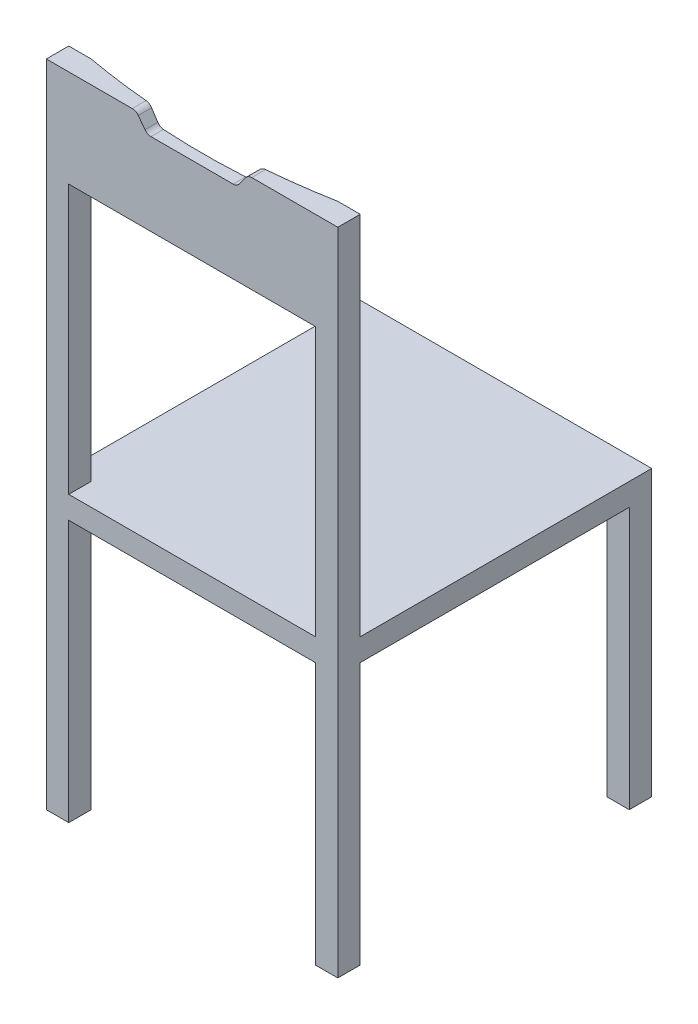
ISO-10303-21;
HEADER;
FILE_DESCRIPTION(('STEP AP214'),'2;1');
FILE_NAME('part.step','',(''),(''),'','','');
FILE_SCHEMA(('AUTOMOTIVE_DESIGN { 1 0 10303 214 1 1 1 1 }'));
ENDSEC;
DATA;
#1=APPLICATION_CONTEXT('core data for automotive mechanical design processes');
#2=APPLICATION_PROTOCOL_DEFINITION('international standard','automotive_design',2000,#1);
#3=PRODUCT_CONTEXT('',#1,'mechanical');
#4=PRODUCT('Part','Part','',(#3));
#5=PRODUCT_RELATED_PRODUCT_CATEGORY('part','',(#4));
#6=PRODUCT_DEFINITION_FORMATION('','',#4);
#7=PRODUCT_DEFINITION_CONTEXT('part definition',#1,'design');
#8=PRODUCT_DEFINITION('design','',#6,#7);
#9=PRODUCT_DEFINITION_SHAPE('','',#8);
#10=(LENGTH_UNIT() NAMED_UNIT(*) SI_UNIT(.MILLI.,.METRE.));
#11=(NAMED_UNIT(*) PLANE_ANGLE_UNIT() SI_UNIT($,.RADIAN.));
#12=(NAMED_UNIT(*) SI_UNIT($,.STERADIAN.) SOLID_ANGLE_UNIT());
#13=UNCERTAINTY_MEASURE_WITH_UNIT(LENGTH_MEASURE(1.E-05),#10,'distance_accuracy_value','');
#14=(GEOMETRIC_REPRESENTATION_CONTEXT(3) GLOBAL_UNCERTAINTY_ASSIGNED_CONTEXT((#13)) GLOBAL_UNIT_ASSIGNED_CONTEXT((#10,
#11,#12)) REPRESENTATION_CONTEXT('',''));
#15=CARTESIAN_POINT('',(0.,0.,0.));
#16=DIRECTION('',(0.,0.,1.));
#17=DIRECTION('',(1.,0.,0.));
#18=AXIS2_PLACEMENT_3D('',#15,#16,#17);
#19=CARTESIAN_POINT('',(0.,489.54,0.));
#20=DIRECTION('',(0.,-1.,0.));
#21=DIRECTION('',(0.,0.,-1.));
#22=AXIS2_PLACEMENT_3D('',#19,#20,#21);
#23=PLANE('',#22);
#24=DIRECTION('',(1.,0.,0.));
#25=VECTOR('',#24,1.);
#26=CARTESIAN_POINT('',(-195.,489.54,210.));
#27=LINE('',#26,#25);
#28=CARTESIAN_POINT('',(-195.,489.54,210.));
#29=VERTEX_POINT('',#28);
#30=CARTESIAN_POINT('',(-80.0000000000001,489.54,210.));
#31=VERTEX_POINT('',#30);
#32=EDGE_CURVE('E365',#29,#31,#27,.T.);
#33=ORIENTED_EDGE('',*,*,#32,.T.);
#34=DIRECTION('',(0.,0.,1.));
#35=VECTOR('',#34,1.);
#36=CARTESIAN_POINT('',(-80.0000000000001,489.54,0.));
#37=LINE('',#36,#35);
#38=CARTESIAN_POINT('',(-80.0000000000001,489.54,191.496023030271));
#39=VERTEX_POINT('',#38);
#40=EDGE_CURVE('E50',#31,#39,#37,.F.);
#41=ORIENTED_EDGE('',*,*,#40,.T.);
#42=CARTESIAN_POINT('',(0.,489.54,-719.999999999999));
#43=DIRECTION('',(0.,-1.,0.));
#44=DIRECTION('',(0.,0.,1.));
#45=AXIS2_PLACEMENT_3D('',#42,#43,#44);
#46=CIRCLE('',#45,914.999999999999);
#47=CARTESIAN_POINT('',(-165.,489.54,180.));
#48=VERTEX_POINT('',#47);
#49=EDGE_CURVE('E513',#39,#48,#46,.T.);
#50=ORIENTED_EDGE('',*,*,#49,.T.);
#51=DIRECTION('',(-1.,0.,0.));
#52=VECTOR('',#51,1.);
#53=CARTESIAN_POINT('',(-195.,489.54,180.));
#54=LINE('',#53,#52);
#55=CARTESIAN_POINT('',(-195.,489.54,180.));
#56=VERTEX_POINT('',#55);
#57=EDGE_CURVE('E340',#48,#56,#54,.T.);
#58=ORIENTED_EDGE('',*,*,#57,.T.);
#59=DIRECTION('',(0.,0.,1.));
#60=VECTOR('',#59,1.);
#61=CARTESIAN_POINT('',(-195.,489.54,210.));
#62=LINE('',#61,#60);
#63=EDGE_CURVE('E361',#56,#29,#62,.T.);
#64=ORIENTED_EDGE('',*,*,#63,.T.);
#65=EDGE_LOOP('',(#33,#41,#50,#58,#64));
#66=FACE_BOUND('',#65,.T.);
#67=ADVANCED_FACE('F41',(#66),#23,.F.);
#68=CARTESIAN_POINT('',(-165.,-430.,210.));
#69=DIRECTION('',(1.,0.,0.));
#70=DIRECTION('',(0.,0.,-1.));
#71=AXIS2_PLACEMENT_3D('',#68,#69,#70);
#72=PLANE('',#71);
#73=DIRECTION('',(0.,1.,0.));
#74=VECTOR('',#73,1.);
#75=CARTESIAN_POINT('',(-165.,-430.,180.));
#76=LINE('',#75,#74);
#77=CARTESIAN_POINT('',(-165.,0.,180.));
#78=VERTEX_POINT('',#77);
#79=CARTESIAN_POINT('',(-165.,359.54,180.));
#80=VERTEX_POINT('',#79);
#81=EDGE_CURVE('E368',#78,#80,#76,.T.);
#82=ORIENTED_EDGE('',*,*,#81,.T.);
#83=DIRECTION('',(0.,0.,1.));
#84=VECTOR('',#83,1.);
#85=CARTESIAN_POINT('',(-165.,359.54,180.));
#86=LINE('',#85,#84);
#87=CARTESIAN_POINT('',(-165.,359.54,210.));
#88=VERTEX_POINT('',#87);
#89=EDGE_CURVE('E605',#80,#88,#86,.T.);
#90=ORIENTED_EDGE('',*,*,#89,.T.);
#91=DIRECTION('',(0.,1.,0.));
#92=VECTOR('',#91,1.);
#93=CARTESIAN_POINT('',(-165.,-430.,210.));
#94=LINE('',#93,#92);
#95=CARTESIAN_POINT('',(-165.,0.,210.));
#96=VERTEX_POINT('',#95);
#97=EDGE_CURVE('E372',#96,#88,#94,.T.);
#98=ORIENTED_EDGE('',*,*,#97,.F.);
#99=DIRECTION('',(0.,0.,1.));
#100=VECTOR('',#99,1.);
#101=CARTESIAN_POINT('',(-165.,0.,180.));
#102=LINE('',#101,#100);
#103=EDGE_CURVE('E344',#78,#96,#102,.T.);
#104=ORIENTED_EDGE('',*,*,#103,.F.);
#105=EDGE_LOOP('',(#82,#90,#98,#104));
#106=FACE_BOUND('',#105,.T.);
#107=ADVANCED_FACE('F468',(#106),#72,.T.);
#108=CARTESIAN_POINT('',(165.,-430.,210.));
#109=DIRECTION('',(-1.,0.,0.));
#110=DIRECTION('',(0.,0.,1.));
#111=AXIS2_PLACEMENT_3D('',#108,#109,#110);
#112=PLANE('',#111);
#113=DIRECTION('',(0.,1.,0.));
#114=VECTOR('',#113,1.);
#115=CARTESIAN_POINT('',(165.,-430.,210.));
#116=LINE('',#115,#114);
#117=CARTESIAN_POINT('',(165.,0.,210.));
#118=VERTEX_POINT('',#117);
#119=CARTESIAN_POINT('',(165.,359.54,210.));
#120=VERTEX_POINT('',#119);
#121=EDGE_CURVE('E293',#118,#120,#116,.T.);
#122=ORIENTED_EDGE('',*,*,#121,.T.);
#123=DIRECTION('',(0.,0.,-1.));
#124=VECTOR('',#123,1.);
#125=CARTESIAN_POINT('',(165.,359.54,210.));
#126=LINE('',#125,#124);
#127=CARTESIAN_POINT('',(165.,359.54,180.));
#128=VERTEX_POINT('',#127);
#129=EDGE_CURVE('E602',#120,#128,#126,.T.);
#130=ORIENTED_EDGE('',*,*,#129,.T.);
#131=DIRECTION('',(0.,1.,0.));
#132=VECTOR('',#131,1.);
#133=CARTESIAN_POINT('',(165.,-430.,180.));
#134=LINE('',#133,#132);
#135=CARTESIAN_POINT('',(165.,0.,180.));
#136=VERTEX_POINT('',#135);
#137=EDGE_CURVE('E297',#136,#128,#134,.T.);
#138=ORIENTED_EDGE('',*,*,#137,.F.);
#139=DIRECTION('',(0.,0.,-1.));
#140=VECTOR('',#139,1.);
#141=CARTESIAN_POINT('',(165.,0.,210.));
#142=LINE('',#141,#140);
#143=EDGE_CURVE('E350',#118,#136,#142,.T.);
#144=ORIENTED_EDGE('',*,*,#143,.F.);
#145=EDGE_LOOP('',(#122,#130,#138,#144));
#146=FACE_BOUND('',#145,.T.);
#147=ADVANCED_FACE('F435',(#146),#112,.T.);
#148=CARTESIAN_POINT('',(-195.,-430.,180.));
#149=DIRECTION('',(0.,0.,-1.));
#150=DIRECTION('',(-1.,0.,0.));
#151=AXIS2_PLACEMENT_3D('',#148,#149,#150);
#152=PLANE('',#151);
#153=ORIENTED_EDGE('',*,*,#81,.F.);
#154=DIRECTION('',(1.,0.,0.));
#155=VECTOR('',#154,1.);
#156=CARTESIAN_POINT('',(-195.,0.,180.));
#157=LINE('',#156,#155);
#158=CARTESIAN_POINT('',(-195.,0.,180.));
#159=VERTEX_POINT('',#158);
#160=EDGE_CURVE('E342',#159,#78,#157,.T.);
#161=ORIENTED_EDGE('',*,*,#160,.F.);
#162=DIRECTION('',(0.,1.,0.));
#163=VECTOR('',#162,1.);
#164=CARTESIAN_POINT('',(-195.,-430.,180.));
#165=LINE('',#164,#163);
#166=EDGE_CURVE('E377',#159,#56,#165,.T.);
#167=ORIENTED_EDGE('',*,*,#166,.T.);
#168=ORIENTED_EDGE('',*,*,#57,.F.);
#169=DIRECTION('',(0.,1.,0.));
#170=VECTOR('',#169,1.);
#171=CARTESIAN_POINT('',(-165.,359.54,180.));
#172=LINE('',#171,#170);
#173=EDGE_CURVE('E612',#80,#48,#172,.T.);
#174=ORIENTED_EDGE('',*,*,#173,.F.);
#175=EDGE_LOOP('',(#153,#161,#167,#168,#174));
#176=FACE_BOUND('',#175,.T.);
#177=ADVANCED_FACE('F465',(#176),#152,.T.);
#178=DIRECTION('',(0.,0.,1.));
#179=VECTOR('',#178,1.);
#180=CARTESIAN_POINT('',(-165.,-380.46,210.));
#181=LINE('',#180,#179);
#182=CARTESIAN_POINT('',(-165.,-380.46,180.));
#183=VERTEX_POINT('',#182);
#184=CARTESIAN_POINT('',(-165.,-380.46,210.));
#185=VERTEX_POINT('',#184);
#186=EDGE_CURVE('E635',#183,#185,#181,.T.);
#187=ORIENTED_EDGE('',*,*,#186,.F.);
#188=CARTESIAN_POINT('',(-165.,-30.,180.));
#189=VERTEX_POINT('',#188);
#190=EDGE_CURVE('E378',#183,#189,#76,.T.);
#191=ORIENTED_EDGE('',*,*,#190,.T.);
#192=DIRECTION('',(0.,0.,1.));
#193=VECTOR('',#192,1.);
#194=CARTESIAN_POINT('',(-165.,-30.,180.));
#195=LINE('',#194,#193);
#196=CARTESIAN_POINT('',(-165.,-30.,210.));
#197=VERTEX_POINT('',#196);
#198=EDGE_CURVE('E317',#189,#197,#195,.T.);
#199=ORIENTED_EDGE('',*,*,#198,.T.);
#200=EDGE_CURVE('E369',#185,#197,#94,.T.);
#201=ORIENTED_EDGE('',*,*,#200,.F.);
#202=EDGE_LOOP('',(#187,#191,#199,#201));
#203=FACE_BOUND('',#202,.T.);
#204=ADVANCED_FACE('F457',(#203),#72,.T.);
#205=CARTESIAN_POINT('',(-195.,-430.,210.));
#206=DIRECTION('',(0.,0.,1.));
#207=DIRECTION('',(1.,0.,0.));
#208=AXIS2_PLACEMENT_3D('',#205,#206,#207);
#209=PLANE('',#208);
#210=DIRECTION('',(-1.,0.,0.));
#211=VECTOR('',#210,1.);
#212=CARTESIAN_POINT('',(-195.,-380.46,210.));
#213=LINE('',#212,#211);
#214=CARTESIAN_POINT('',(195.,-380.46,210.));
#215=VERTEX_POINT('',#214);
#216=CARTESIAN_POINT('',(165.,-380.46,210.));
#217=VERTEX_POINT('',#216);
#218=EDGE_CURVE('E632',#215,#217,#213,.T.);
#219=ORIENTED_EDGE('',*,*,#218,.F.);
#220=DIRECTION('',(0.,1.,0.));
#221=VECTOR('',#220,1.);
#222=CARTESIAN_POINT('',(195.,-430.,210.));
#223=LINE('',#222,#221);
#224=CARTESIAN_POINT('',(195.,489.54,210.));
#225=VERTEX_POINT('',#224);
#226=EDGE_CURVE('E301',#215,#225,#223,.T.);
#227=ORIENTED_EDGE('',*,*,#226,.T.);
#228=CARTESIAN_POINT('',(80.0000000000001,489.54,210.));
#229=VERTEX_POINT('',#228);
#230=EDGE_CURVE('E364',#229,#225,#27,.T.);
#231=ORIENTED_EDGE('',*,*,#230,.F.);
#232=CARTESIAN_POINT('',(80.0000000000001,479.54,210.));
#233=DIRECTION('',(0.,0.,1.));
#234=DIRECTION('',(1.,0.,0.));
#235=AXIS2_PLACEMENT_3D('',#232,#233,#234);
#236=CIRCLE('',#235,10.);
#237=CARTESIAN_POINT('',(72.,485.54,210.));
#238=VERTEX_POINT('',#237);
#239=EDGE_CURVE('E384',#229,#238,#236,.T.);
#240=ORIENTED_EDGE('',*,*,#239,.T.);
#241=DIRECTION('',(0.599999999999999,0.800000000000001,0.));
#242=VECTOR('',#241,1.);
#243=CARTESIAN_POINT('',(75.,489.54,210.));
#244=LINE('',#243,#242);
#245=CARTESIAN_POINT('',(63.,473.54,210.));
#246=VERTEX_POINT('',#245);
#247=EDGE_CURVE('E520',#246,#238,#244,.T.);
#248=ORIENTED_EDGE('',*,*,#247,.F.);
#249=CARTESIAN_POINT('',(55.,479.54,210.));
#250=DIRECTION('',(0.,0.,1.));
#251=DIRECTION('',(-1.,0.,0.));
#252=AXIS2_PLACEMENT_3D('',#249,#250,#251);
#253=CIRCLE('',#252,10.);
#254=CARTESIAN_POINT('',(55.,469.54,210.));
#255=VERTEX_POINT('',#254);
#256=EDGE_CURVE('E527',#255,#246,#253,.T.);
#257=ORIENTED_EDGE('',*,*,#256,.F.);
#258=DIRECTION('',(1.,0.,0.));
#259=VECTOR('',#258,1.);
#260=CARTESIAN_POINT('',(-55.,469.54,210.));
#261=LINE('',#260,#259);
#262=CARTESIAN_POINT('',(-55.,469.54,210.));
#263=VERTEX_POINT('',#262);
#264=EDGE_CURVE('E532',#263,#255,#261,.T.);
#265=ORIENTED_EDGE('',*,*,#264,.F.);
#266=CARTESIAN_POINT('',(-55.,479.54,210.));
#267=DIRECTION('',(0.,0.,1.));
#268=DIRECTION('',(1.,0.,0.));
#269=AXIS2_PLACEMENT_3D('',#266,#267,#268);
#270=CIRCLE('',#269,10.);
#271=CARTESIAN_POINT('',(-63.,473.54,210.));
#272=VERTEX_POINT('',#271);
#273=EDGE_CURVE('E583',#272,#263,#270,.T.);
#274=ORIENTED_EDGE('',*,*,#273,.F.);
#275=DIRECTION('',(0.599999999999999,-0.800000000000001,0.));
#276=VECTOR('',#275,1.);
#277=CARTESIAN_POINT('',(-75.,489.54,210.));
#278=LINE('',#277,#276);
#279=CARTESIAN_POINT('',(-72.,485.54,210.));
#280=VERTEX_POINT('',#279);
#281=EDGE_CURVE('E585',#280,#272,#278,.T.);
#282=ORIENTED_EDGE('',*,*,#281,.F.);
#283=CARTESIAN_POINT('',(-80.0000000000001,479.54,210.));
#284=DIRECTION('',(0.,0.,1.));
#285=DIRECTION('',(1.,0.,0.));
#286=AXIS2_PLACEMENT_3D('',#283,#284,#285);
#287=CIRCLE('',#286,10.);
#288=EDGE_CURVE('E382',#280,#31,#287,.T.);
#289=ORIENTED_EDGE('',*,*,#288,.T.);
#290=ORIENTED_EDGE('',*,*,#32,.F.);
#291=DIRECTION('',(0.,1.,0.));
#292=VECTOR('',#291,1.);
#293=CARTESIAN_POINT('',(-195.,-430.,210.));
#294=LINE('',#293,#292);
#295=CARTESIAN_POINT('',(-195.,-380.46,210.));
#296=VERTEX_POINT('',#295);
#297=EDGE_CURVE('E373',#296,#29,#294,.T.);
#298=ORIENTED_EDGE('',*,*,#297,.F.);
#299=EDGE_CURVE('E629',#185,#296,#213,.T.);
#300=ORIENTED_EDGE('',*,*,#299,.F.);
#301=ORIENTED_EDGE('',*,*,#200,.T.);
#302=DIRECTION('',(1.,0.,0.));
#303=VECTOR('',#302,1.);
#304=CARTESIAN_POINT('',(-165.,-30.,210.));
#305=LINE('',#304,#303);
#306=CARTESIAN_POINT('',(165.,-30.,210.));
#307=VERTEX_POINT('',#306);
#308=EDGE_CURVE('E320',#197,#307,#305,.T.);
#309=ORIENTED_EDGE('',*,*,#308,.T.);
#310=EDGE_CURVE('E303',#217,#307,#116,.T.);
#311=ORIENTED_EDGE('',*,*,#310,.F.);
#312=EDGE_LOOP('',(#219,#227,#231,#240,#248,#257,#265,#274,#282,#289,#290,#298,#300,#301,#309,#311));
#313=FACE_BOUND('',#312,.T.);
#314=ORIENTED_EDGE('',*,*,#97,.T.);
#315=DIRECTION('',(1.,0.,0.));
#316=VECTOR('',#315,1.);
#317=CARTESIAN_POINT('',(-165.,359.54,210.));
#318=LINE('',#317,#316);
#319=EDGE_CURVE('E613',#88,#120,#318,.T.);
#320=ORIENTED_EDGE('',*,*,#319,.T.);
#321=ORIENTED_EDGE('',*,*,#121,.F.);
#322=DIRECTION('',(1.,0.,0.));
#323=VECTOR('',#322,1.);
#324=CARTESIAN_POINT('',(-165.,0.,210.));
#325=LINE('',#324,#323);
#326=EDGE_CURVE('E347',#96,#118,#325,.T.);
#327=ORIENTED_EDGE('',*,*,#326,.F.);
#328=EDGE_LOOP('',(#314,#320,#321,#327));
#329=FACE_BOUND('',#328,.T.);
#330=ADVANCED_FACE('F453',(#313,#329),#209,.T.);
#331=CARTESIAN_POINT('',(-195.,-430.,210.));
#332=DIRECTION('',(-1.,0.,0.));
#333=DIRECTION('',(0.,0.,1.));
#334=AXIS2_PLACEMENT_3D('',#331,#332,#333);
#335=PLANE('',#334);
#336=DIRECTION('',(0.,0.,1.));
#337=VECTOR('',#336,1.);
#338=CARTESIAN_POINT('',(-195.,-380.46,-210.));
#339=LINE('',#338,#337);
#340=CARTESIAN_POINT('',(-195.,-380.46,180.));
#341=VERTEX_POINT('',#340);
#342=EDGE_CURVE('E57',#341,#296,#339,.T.);
#343=ORIENTED_EDGE('',*,*,#342,.T.);
#344=ORIENTED_EDGE('',*,*,#297,.T.);
#345=ORIENTED_EDGE('',*,*,#63,.F.);
#346=ORIENTED_EDGE('',*,*,#166,.F.);
#347=DIRECTION('',(0.,0.,1.));
#348=VECTOR('',#347,1.);
#349=CARTESIAN_POINT('',(-195.,0.,180.));
#350=LINE('',#349,#348);
#351=CARTESIAN_POINT('',(-195.,0.,-210.));
#352=VERTEX_POINT('',#351);
#353=EDGE_CURVE('E296',#352,#159,#350,.T.);
#354=ORIENTED_EDGE('',*,*,#353,.F.);
#355=DIRECTION('',(0.,1.,0.));
#356=VECTOR('',#355,1.);
#357=CARTESIAN_POINT('',(-195.,-430.,-210.));
#358=LINE('',#357,#356);
#359=CARTESIAN_POINT('',(-195.,-380.46,-210.));
#360=VERTEX_POINT('',#359);
#361=EDGE_CURVE('E280',#360,#352,#358,.T.);
#362=ORIENTED_EDGE('',*,*,#361,.F.);
#363=CARTESIAN_POINT('',(-195.,-380.46,-180.));
#364=VERTEX_POINT('',#363);
#365=EDGE_CURVE('E658',#360,#364,#339,.T.);
#366=ORIENTED_EDGE('',*,*,#365,.T.);
#367=DIRECTION('',(0.,1.,0.));
#368=VECTOR('',#367,1.);
#369=CARTESIAN_POINT('',(-195.,-430.,-180.));
#370=LINE('',#369,#368);
#371=CARTESIAN_POINT('',(-195.,-30.,-180.));
#372=VERTEX_POINT('',#371);
#373=EDGE_CURVE('E272',#364,#372,#370,.T.);
#374=ORIENTED_EDGE('',*,*,#373,.T.);
#375=DIRECTION('',(0.,0.,1.));
#376=VECTOR('',#375,1.);
#377=CARTESIAN_POINT('',(-195.,-30.,180.));
#378=LINE('',#377,#376);
#379=CARTESIAN_POINT('',(-195.,-30.,180.));
#380=VERTEX_POINT('',#379);
#381=EDGE_CURVE('E311',#372,#380,#378,.T.);
#382=ORIENTED_EDGE('',*,*,#381,.T.);
#383=EDGE_CURVE('E375',#341,#380,#165,.T.);
#384=ORIENTED_EDGE('',*,*,#383,.F.);
#385=EDGE_LOOP('',(#343,#344,#345,#346,#354,#362,#366,#374,#382,#384));
#386=FACE_BOUND('',#385,.T.);
#387=ADVANCED_FACE('F456',(#386),#335,.T.);
#388=DIRECTION('',(1.,0.,0.));
#389=VECTOR('',#388,1.);
#390=CARTESIAN_POINT('',(-195.,-380.46,180.));
#391=LINE('',#390,#389);
#392=EDGE_CURVE('E642',#341,#183,#391,.T.);
#393=ORIENTED_EDGE('',*,*,#392,.F.);
#394=ORIENTED_EDGE('',*,*,#383,.T.);
#395=DIRECTION('',(1.,0.,0.));
#396=VECTOR('',#395,1.);
#397=CARTESIAN_POINT('',(-195.,-30.,180.));
#398=LINE('',#397,#396);
#399=EDGE_CURVE('E314',#380,#189,#398,.T.);
#400=ORIENTED_EDGE('',*,*,#399,.T.);
#401=ORIENTED_EDGE('',*,*,#190,.F.);
#402=EDGE_LOOP('',(#393,#394,#400,#401));
#403=FACE_BOUND('',#402,.T.);
#404=ADVANCED_FACE('F451',(#403),#152,.T.);
#405=CARTESIAN_POINT('',(165.,489.54,180.));
#406=VERTEX_POINT('',#405);
#407=CARTESIAN_POINT('',(80.0000000000001,489.54,191.496023030271));
#408=VERTEX_POINT('',#407);
#409=EDGE_CURVE('E503',#406,#408,#46,.T.);
#410=ORIENTED_EDGE('',*,*,#409,.T.);
#411=DIRECTION('',(0.,0.,1.));
#412=VECTOR('',#411,1.);
#413=CARTESIAN_POINT('',(80.0000000000001,489.54,0.));
#414=LINE('',#413,#412);
#415=EDGE_CURVE('E371',#408,#229,#414,.T.);
#416=ORIENTED_EDGE('',*,*,#415,.T.);
#417=ORIENTED_EDGE('',*,*,#230,.T.);
#418=DIRECTION('',(0.,0.,-1.));
#419=VECTOR('',#418,1.);
#420=CARTESIAN_POINT('',(195.,489.54,210.));
#421=LINE('',#420,#419);
#422=CARTESIAN_POINT('',(195.,489.54,180.));
#423=VERTEX_POINT('',#422);
#424=EDGE_CURVE('E282',#225,#423,#421,.T.);
#425=ORIENTED_EDGE('',*,*,#424,.T.);
#426=DIRECTION('',(-1.,0.,0.));
#427=VECTOR('',#426,1.);
#428=CARTESIAN_POINT('',(195.,489.54,180.));
#429=LINE('',#428,#427);
#430=EDGE_CURVE('E290',#423,#406,#429,.T.);
#431=ORIENTED_EDGE('',*,*,#430,.T.);
#432=EDGE_LOOP('',(#410,#416,#417,#425,#431));
#433=FACE_BOUND('',#432,.T.);
#434=ADVANCED_FACE('F446',(#433),#23,.F.);
#435=CARTESIAN_POINT('',(-165.,-30.,-210.));
#436=DIRECTION('',(0.,0.,-1.));
#437=DIRECTION('',(-1.,0.,0.));
#438=AXIS2_PLACEMENT_3D('',#435,#436,#437);
#439=PLANE('',#438);
#440=DIRECTION('',(-1.,0.,0.));
#441=VECTOR('',#440,1.);
#442=CARTESIAN_POINT('',(-195.,-380.46,-210.));
#443=LINE('',#442,#441);
#444=CARTESIAN_POINT('',(-165.,-380.46,-210.));
#445=VERTEX_POINT('',#444);
#446=EDGE_CURVE('E254',#445,#360,#443,.T.);
#447=ORIENTED_EDGE('',*,*,#446,.T.);
#448=ORIENTED_EDGE('',*,*,#361,.T.);
#449=DIRECTION('',(-1.,0.,0.));
#450=VECTOR('',#449,1.);
#451=CARTESIAN_POINT('',(-165.,0.,-210.));
#452=LINE('',#451,#450);
#453=CARTESIAN_POINT('',(195.,0.,-210.));
#454=VERTEX_POINT('',#453);
#455=EDGE_CURVE('E268',#454,#352,#452,.T.);
#456=ORIENTED_EDGE('',*,*,#455,.F.);
#457=DIRECTION('',(0.,1.,0.));
#458=VECTOR('',#457,1.);
#459=CARTESIAN_POINT('',(195.,-430.,-210.));
#460=LINE('',#459,#458);
#461=CARTESIAN_POINT('',(195.,-380.46,-210.));
#462=VERTEX_POINT('',#461);
#463=EDGE_CURVE('E260',#462,#454,#460,.T.);
#464=ORIENTED_EDGE('',*,*,#463,.F.);
#465=CARTESIAN_POINT('',(165.,-380.46,-210.));
#466=VERTEX_POINT('',#465);
#467=EDGE_CURVE('E243',#462,#466,#443,.T.);
#468=ORIENTED_EDGE('',*,*,#467,.T.);
#469=DIRECTION('',(0.,1.,0.));
#470=VECTOR('',#469,1.);
#471=CARTESIAN_POINT('',(165.,-430.,-210.));
#472=LINE('',#471,#470);
#473=CARTESIAN_POINT('',(165.,-30.,-210.));
#474=VERTEX_POINT('',#473);
#475=EDGE_CURVE('E270',#466,#474,#472,.T.);
#476=ORIENTED_EDGE('',*,*,#475,.T.);
#477=DIRECTION('',(-1.,0.,0.));
#478=VECTOR('',#477,1.);
#479=CARTESIAN_POINT('',(-165.,-30.,-210.));
#480=LINE('',#479,#478);
#481=CARTESIAN_POINT('',(-165.,-30.,-210.));
#482=VERTEX_POINT('',#481);
#483=EDGE_CURVE('E337',#474,#482,#480,.T.);
#484=ORIENTED_EDGE('',*,*,#483,.T.);
#485=DIRECTION('',(0.,1.,0.));
#486=VECTOR('',#485,1.);
#487=CARTESIAN_POINT('',(-165.,-430.,-210.));
#488=LINE('',#487,#486);
#489=EDGE_CURVE('E283',#445,#482,#488,.T.);
#490=ORIENTED_EDGE('',*,*,#489,.F.);
#491=EDGE_LOOP('',(#447,#448,#456,#464,#468,#476,#484,#490));
#492=FACE_BOUND('',#491,.T.);
#493=ADVANCED_FACE('F266',(#492),#439,.T.);
#494=CARTESIAN_POINT('',(195.,-30.,-180.));
#495=DIRECTION('',(1.,0.,0.));
#496=DIRECTION('',(0.,0.,-1.));
#497=AXIS2_PLACEMENT_3D('',#494,#495,#496);
#498=PLANE('',#497);
#499=DIRECTION('',(0.,0.,1.));
#500=VECTOR('',#499,1.);
#501=CARTESIAN_POINT('',(195.,-380.46,-210.));
#502=LINE('',#501,#500);
#503=CARTESIAN_POINT('',(195.,-380.46,-180.));
#504=VERTEX_POINT('',#503);
#505=EDGE_CURVE('E246',#462,#504,#502,.T.);
#506=ORIENTED_EDGE('',*,*,#505,.F.);
#507=ORIENTED_EDGE('',*,*,#463,.T.);
#508=DIRECTION('',(0.,0.,-1.));
#509=VECTOR('',#508,1.);
#510=CARTESIAN_POINT('',(195.,0.,-180.));
#511=LINE('',#510,#509);
#512=CARTESIAN_POINT('',(195.,0.,180.));
#513=VERTEX_POINT('',#512);
#514=EDGE_CURVE('E356',#513,#454,#511,.T.);
#515=ORIENTED_EDGE('',*,*,#514,.F.);
#516=DIRECTION('',(0.,1.,0.));
#517=VECTOR('',#516,1.);
#518=CARTESIAN_POINT('',(195.,-430.,180.));
#519=LINE('',#518,#517);
#520=EDGE_CURVE('E300',#513,#423,#519,.T.);
#521=ORIENTED_EDGE('',*,*,#520,.T.);
#522=ORIENTED_EDGE('',*,*,#424,.F.);
#523=ORIENTED_EDGE('',*,*,#226,.F.);
#524=CARTESIAN_POINT('',(195.,-380.46,180.));
#525=VERTEX_POINT('',#524);
#526=EDGE_CURVE('E253',#525,#215,#502,.T.);
#527=ORIENTED_EDGE('',*,*,#526,.F.);
#528=CARTESIAN_POINT('',(195.,-30.,180.));
#529=VERTEX_POINT('',#528);
#530=EDGE_CURVE('E298',#525,#529,#519,.T.);
#531=ORIENTED_EDGE('',*,*,#530,.T.);
#532=DIRECTION('',(0.,0.,-1.));
#533=VECTOR('',#532,1.);
#534=CARTESIAN_POINT('',(195.,-30.,-180.));
#535=LINE('',#534,#533);
#536=CARTESIAN_POINT('',(195.,-30.,-180.));
#537=VERTEX_POINT('',#536);
#538=EDGE_CURVE('E329',#529,#537,#535,.T.);
#539=ORIENTED_EDGE('',*,*,#538,.T.);
#540=DIRECTION('',(0.,1.,0.));
#541=VECTOR('',#540,1.);
#542=CARTESIAN_POINT('',(195.,-430.,-180.));
#543=LINE('',#542,#541);
#544=EDGE_CURVE('E263',#504,#537,#543,.T.);
#545=ORIENTED_EDGE('',*,*,#544,.F.);
#546=EDGE_LOOP('',(#506,#507,#515,#521,#522,#523,#527,#531,#539,#545));
#547=FACE_BOUND('',#546,.T.);
#548=ADVANCED_FACE('F258',(#547),#498,.T.);
#549=CARTESIAN_POINT('',(0.,-30.,0.));
#550=DIRECTION('',(0.,-1.,0.));
#551=DIRECTION('',(0.,0.,-1.));
#552=AXIS2_PLACEMENT_3D('',#549,#550,#551);
#553=PLANE('',#552);
#554=DIRECTION('',(0.,0.,1.));
#555=VECTOR('',#554,1.);
#556=CARTESIAN_POINT('',(-165.,-30.,-180.));
#557=LINE('',#556,#555);
#558=CARTESIAN_POINT('',(-165.,-30.,-180.));
#559=VERTEX_POINT('',#558);
#560=EDGE_CURVE('E305',#482,#559,#557,.T.);
#561=ORIENTED_EDGE('',*,*,#560,.F.);
#562=ORIENTED_EDGE('',*,*,#483,.F.);
#563=DIRECTION('',(0.,0.,-1.));
#564=VECTOR('',#563,1.);
#565=CARTESIAN_POINT('',(165.,-30.,-210.));
#566=LINE('',#565,#564);
#567=CARTESIAN_POINT('',(165.,-30.,-180.));
#568=VERTEX_POINT('',#567);
#569=EDGE_CURVE('E334',#568,#474,#566,.T.);
#570=ORIENTED_EDGE('',*,*,#569,.F.);
#571=DIRECTION('',(-1.,0.,0.));
#572=VECTOR('',#571,1.);
#573=CARTESIAN_POINT('',(165.,-30.,-180.));
#574=LINE('',#573,#572);
#575=EDGE_CURVE('E331',#537,#568,#574,.T.);
#576=ORIENTED_EDGE('',*,*,#575,.F.);
#577=ORIENTED_EDGE('',*,*,#538,.F.);
#578=DIRECTION('',(1.,0.,0.));
#579=VECTOR('',#578,1.);
#580=CARTESIAN_POINT('',(165.,-30.,180.));
#581=LINE('',#580,#579);
#582=CARTESIAN_POINT('',(165.,-30.,180.));
#583=VERTEX_POINT('',#582);
#584=EDGE_CURVE('E326',#583,#529,#581,.T.);
#585=ORIENTED_EDGE('',*,*,#584,.F.);
#586=DIRECTION('',(0.,0.,-1.));
#587=VECTOR('',#586,1.);
#588=CARTESIAN_POINT('',(165.,-30.,210.));
#589=LINE('',#588,#587);
#590=EDGE_CURVE('E323',#307,#583,#589,.T.);
#591=ORIENTED_EDGE('',*,*,#590,.F.);
#592=ORIENTED_EDGE('',*,*,#308,.F.);
#593=ORIENTED_EDGE('',*,*,#198,.F.);
#594=ORIENTED_EDGE('',*,*,#399,.F.);
#595=ORIENTED_EDGE('',*,*,#381,.F.);
#596=DIRECTION('',(-1.,0.,0.));
#597=VECTOR('',#596,1.);
#598=CARTESIAN_POINT('',(-195.,-30.,-180.));
#599=LINE('',#598,#597);
#600=EDGE_CURVE('E308',#559,#372,#599,.T.);
#601=ORIENTED_EDGE('',*,*,#600,.F.);
#602=EDGE_LOOP('',(#561,#562,#570,#576,#577,#585,#591,#592,#593,#594,#595,#601));
#603=FACE_BOUND('',#602,.T.);
#604=ADVANCED_FACE('F436',(#603),#553,.T.);
#605=CARTESIAN_POINT('',(0.,0.,0.));
#606=DIRECTION('',(0.,-1.,0.));
#607=DIRECTION('',(0.,0.,-1.));
#608=AXIS2_PLACEMENT_3D('',#605,#606,#607);
#609=PLANE('',#608);
#610=ORIENTED_EDGE('',*,*,#514,.T.);
#611=ORIENTED_EDGE('',*,*,#455,.T.);
#612=ORIENTED_EDGE('',*,*,#353,.T.);
#613=ORIENTED_EDGE('',*,*,#160,.T.);
#614=ORIENTED_EDGE('',*,*,#103,.T.);
#615=ORIENTED_EDGE('',*,*,#326,.T.);
#616=ORIENTED_EDGE('',*,*,#143,.T.);
#617=DIRECTION('',(1.,0.,0.));
#618=VECTOR('',#617,1.);
#619=CARTESIAN_POINT('',(165.,0.,180.));
#620=LINE('',#619,#618);
#621=EDGE_CURVE('E353',#136,#513,#620,.T.);
#622=ORIENTED_EDGE('',*,*,#621,.T.);
#623=EDGE_LOOP('',(#610,#611,#612,#613,#614,#615,#616,#622));
#624=FACE_BOUND('',#623,.T.);
#625=ADVANCED_FACE('F439',(#624),#609,.F.);
#626=CARTESIAN_POINT('',(195.,-430.,180.));
#627=DIRECTION('',(0.,0.,-1.));
#628=DIRECTION('',(-1.,0.,0.));
#629=AXIS2_PLACEMENT_3D('',#626,#627,#628);
#630=PLANE('',#629);
#631=ORIENTED_EDGE('',*,*,#621,.F.);
#632=ORIENTED_EDGE('',*,*,#137,.T.);
#633=DIRECTION('',(0.,1.,0.));
#634=VECTOR('',#633,1.);
#635=CARTESIAN_POINT('',(165.,359.54,180.));
#636=LINE('',#635,#634);
#637=EDGE_CURVE('E279',#128,#406,#636,.T.);
#638=ORIENTED_EDGE('',*,*,#637,.T.);
#639=ORIENTED_EDGE('',*,*,#430,.F.);
#640=ORIENTED_EDGE('',*,*,#520,.F.);
#641=EDGE_LOOP('',(#631,#632,#638,#639,#640));
#642=FACE_BOUND('',#641,.T.);
#643=ADVANCED_FACE('F431',(#642),#630,.T.);
#644=DIRECTION('',(0.,0.,-1.));
#645=VECTOR('',#644,1.);
#646=CARTESIAN_POINT('',(165.,-380.46,210.));
#647=LINE('',#646,#645);
#648=CARTESIAN_POINT('',(165.,-380.46,180.));
#649=VERTEX_POINT('',#648);
#650=EDGE_CURVE('E65',#217,#649,#647,.T.);
#651=ORIENTED_EDGE('',*,*,#650,.F.);
#652=ORIENTED_EDGE('',*,*,#310,.T.);
#653=ORIENTED_EDGE('',*,*,#590,.T.);
#654=EDGE_CURVE('E294',#649,#583,#134,.T.);
#655=ORIENTED_EDGE('',*,*,#654,.F.);
#656=EDGE_LOOP('',(#651,#652,#653,#655));
#657=FACE_BOUND('',#656,.T.);
#658=ADVANCED_FACE('F429',(#657),#112,.T.);
#659=DIRECTION('',(1.,0.,0.));
#660=VECTOR('',#659,1.);
#661=CARTESIAN_POINT('',(195.,-380.46,180.));
#662=LINE('',#661,#660);
#663=EDGE_CURVE('E664',#649,#525,#662,.T.);
#664=ORIENTED_EDGE('',*,*,#663,.F.);
#665=ORIENTED_EDGE('',*,*,#654,.T.);
#666=ORIENTED_EDGE('',*,*,#584,.T.);
#667=ORIENTED_EDGE('',*,*,#530,.F.);
#668=EDGE_LOOP('',(#664,#665,#666,#667));
#669=FACE_BOUND('',#668,.T.);
#670=ADVANCED_FACE('F422',(#669),#630,.T.);
#671=CARTESIAN_POINT('',(-165.,-430.,-180.));
#672=DIRECTION('',(1.,0.,0.));
#673=DIRECTION('',(0.,0.,-1.));
#674=AXIS2_PLACEMENT_3D('',#671,#672,#673);
#675=PLANE('',#674);
#676=DIRECTION('',(0.,0.,1.));
#677=VECTOR('',#676,1.);
#678=CARTESIAN_POINT('',(-165.,-380.46,-180.));
#679=LINE('',#678,#677);
#680=CARTESIAN_POINT('',(-165.,-380.46,-180.));
#681=VERTEX_POINT('',#680);
#682=EDGE_CURVE('E652',#445,#681,#679,.T.);
#683=ORIENTED_EDGE('',*,*,#682,.F.);
#684=ORIENTED_EDGE('',*,*,#489,.T.);
#685=ORIENTED_EDGE('',*,*,#560,.T.);
#686=DIRECTION('',(0.,1.,0.));
#687=VECTOR('',#686,1.);
#688=CARTESIAN_POINT('',(-165.,-430.,-180.));
#689=LINE('',#688,#687);
#690=EDGE_CURVE('E285',#681,#559,#689,.T.);
#691=ORIENTED_EDGE('',*,*,#690,.F.);
#692=EDGE_LOOP('',(#683,#684,#685,#691));
#693=FACE_BOUND('',#692,.T.);
#694=ADVANCED_FACE('F419',(#693),#675,.T.);
#695=CARTESIAN_POINT('',(-165.,-430.,-180.));
#696=DIRECTION('',(0.,0.,1.));
#697=DIRECTION('',(1.,0.,0.));
#698=AXIS2_PLACEMENT_3D('',#695,#696,#697);
#699=PLANE('',#698);
#700=DIRECTION('',(-1.,0.,0.));
#701=VECTOR('',#700,1.);
#702=CARTESIAN_POINT('',(-165.,-380.46,-180.));
#703=LINE('',#702,#701);
#704=EDGE_CURVE('E649',#681,#364,#703,.T.);
#705=ORIENTED_EDGE('',*,*,#704,.F.);
#706=ORIENTED_EDGE('',*,*,#690,.T.);
#707=ORIENTED_EDGE('',*,*,#600,.T.);
#708=ORIENTED_EDGE('',*,*,#373,.F.);
#709=EDGE_LOOP('',(#705,#706,#707,#708));
#710=FACE_BOUND('',#709,.T.);
#711=ADVANCED_FACE('F417',(#710),#699,.T.);
#712=CARTESIAN_POINT('',(165.,-430.,-180.));
#713=DIRECTION('',(-1.,0.,0.));
#714=DIRECTION('',(0.,0.,1.));
#715=AXIS2_PLACEMENT_3D('',#712,#713,#714);
#716=PLANE('',#715);
#717=DIRECTION('',(0.,0.,-1.));
#718=VECTOR('',#717,1.);
#719=CARTESIAN_POINT('',(165.,-380.46,-180.));
#720=LINE('',#719,#718);
#721=CARTESIAN_POINT('',(165.,-380.46,-180.));
#722=VERTEX_POINT('',#721);
#723=EDGE_CURVE('E249',#722,#466,#720,.T.);
#724=ORIENTED_EDGE('',*,*,#723,.F.);
#725=DIRECTION('',(0.,1.,0.));
#726=VECTOR('',#725,1.);
#727=CARTESIAN_POINT('',(165.,-430.,-180.));
#728=LINE('',#727,#726);
#729=EDGE_CURVE('E274',#722,#568,#728,.T.);
#730=ORIENTED_EDGE('',*,*,#729,.T.);
#731=ORIENTED_EDGE('',*,*,#569,.T.);
#732=ORIENTED_EDGE('',*,*,#475,.F.);
#733=EDGE_LOOP('',(#724,#730,#731,#732));
#734=FACE_BOUND('',#733,.T.);
#735=ADVANCED_FACE('F413',(#734),#716,.T.);
#736=CARTESIAN_POINT('',(195.,-430.,-180.));
#737=DIRECTION('',(0.,0.,1.));
#738=DIRECTION('',(1.,0.,0.));
#739=AXIS2_PLACEMENT_3D('',#736,#737,#738);
#740=PLANE('',#739);
#741=DIRECTION('',(-1.,0.,0.));
#742=VECTOR('',#741,1.);
#743=CARTESIAN_POINT('',(195.,-380.46,-180.));
#744=LINE('',#743,#742);
#745=EDGE_CURVE('E11',#504,#722,#744,.T.);
#746=ORIENTED_EDGE('',*,*,#745,.F.);
#747=ORIENTED_EDGE('',*,*,#544,.T.);
#748=ORIENTED_EDGE('',*,*,#575,.T.);
#749=ORIENTED_EDGE('',*,*,#729,.F.);
#750=EDGE_LOOP('',(#746,#747,#748,#749));
#751=FACE_BOUND('',#750,.T.);
#752=ADVANCED_FACE('F407',(#751),#740,.T.);
#753=CARTESIAN_POINT('',(0.,359.54,-719.999999999999));
#754=DIRECTION('',(0.,1.,0.));
#755=DIRECTION('',(0.,0.,1.));
#756=AXIS2_PLACEMENT_3D('',#753,#754,#755);
#757=CYLINDRICAL_SURFACE('',#756,914.999999999999);
#758=CARTESIAN_POINT('',(0.,389.54,-719.999999999999));
#759=DIRECTION('',(0.800000000000001,-0.599999999999999,0.));
#760=DIRECTION('',(0.599999999999999,0.800000000000001,0.));
#761=AXIS2_PLACEMENT_3D('',#758,#759,#760);
#762=ELLIPSE('',#761,1525.,914.999999999999);
#763=CARTESIAN_POINT('',(63.,473.54,192.82857098143));
#764=VERTEX_POINT('',#763);
#765=CARTESIAN_POINT('',(72.,485.54,192.162814414181));
#766=VERTEX_POINT('',#765);
#767=EDGE_CURVE('E506',#764,#766,#762,.F.);
#768=ORIENTED_EDGE('',*,*,#767,.T.);
#769=CARTESIAN_POINT('',(72.,485.54,192.162814414181));
#770=CARTESIAN_POINT('',(72.1689764764605,485.765352939201,192.149476597189));
#771=CARTESIAN_POINT('',(72.3474948681626,485.983494455029,192.135338284389));
#772=CARTESIAN_POINT('',(72.722215335469,486.403888706728,192.105539226457));
#773=CARTESIAN_POINT('',(72.9184164897673,486.606142269365,192.089878560638));
#774=CARTESIAN_POINT('',(73.3269198295718,486.993128615253,192.057128016655));
#775=CARTESIAN_POINT('',(73.539206037249,487.177878385411,192.04003955508));
#776=CARTESIAN_POINT('',(73.9785115123169,487.528785520494,192.004511164277));
#777=CARTESIAN_POINT('',(74.2055304559333,487.694943293787,191.986071264748));
#778=CARTESIAN_POINT('',(74.6728381082355,488.007611090134,191.947927369435));
#779=CARTESIAN_POINT('',(74.9131356104201,488.154107867457,191.928222534538));
#780=CARTESIAN_POINT('',(75.405148233561,488.426302764131,191.887671009052));
#781=CARTESIAN_POINT('',(75.6568635141055,488.552000592656,191.866824302502));
#782=CARTESIAN_POINT('',(76.1697836450461,488.781664884478,191.82412243636));
#783=CARTESIAN_POINT('',(76.4309838202137,488.885641888061,191.802267772207));
#784=CARTESIAN_POINT('',(76.9611115616121,489.071211572346,191.757675052373));
#785=CARTESIAN_POINT('',(77.2300377360602,489.152808257112,191.734937155544));
#786=CARTESIAN_POINT('',(77.7057115889296,489.275532152671,191.694501622726));
#787=CARTESIAN_POINT('',(77.9111947782148,489.321676933553,191.676965147527));
#788=CARTESIAN_POINT('',(78.324632234449,489.400904407053,191.641538668433));
#789=CARTESIAN_POINT('',(78.5325863560918,489.433987863879,191.623648685286));
#790=CARTESIAN_POINT('',(78.9500244388057,489.486948394631,191.587591763202));
#791=CARTESIAN_POINT('',(79.1595074854284,489.506832797873,191.569424983711));
#792=CARTESIAN_POINT('',(79.5793283865141,489.533364221697,191.532871100108));
#793=CARTESIAN_POINT('',(79.7896663855181,489.540008901982,191.514483957623));
#794=CARTESIAN_POINT('',(80.0000000000001,489.54,191.496023030271));
#795=B_SPLINE_CURVE_WITH_KNOTS('',3,(#769,#770,#771,#772,#773,#774,#775,#776,#777,#778,#779,
#780,#781,#782,#783,#784,#785,#786,#787,#788,#789,#790,#791,#792,#793,#794),.UNSPECIFIED.,.F.,
.F.,(4,2,2,2,2,2,2,2,2,2,2,2,4),(0.,0.845689520800977,1.69133500499185,2.53615122380479,
3.38094888278897,4.2263128601677,5.07168865698554,5.91665326738469,6.76146660636125,
7.39506226835213,8.0286208535942,8.66182733444983,9.29514573307391),.UNSPECIFIED.);
#796=EDGE_CURVE('E395',#766,#408,#795,.T.);
#797=ORIENTED_EDGE('',*,*,#796,.T.);
#798=ORIENTED_EDGE('',*,*,#409,.F.);
#799=ORIENTED_EDGE('',*,*,#637,.F.);
#800=CARTESIAN_POINT('',(0.,359.54,-719.999999999999));
#801=DIRECTION('',(0.,-1.,0.));
#802=DIRECTION('',(0.,0.,1.));
#803=AXIS2_PLACEMENT_3D('',#800,#801,#802);
#804=CIRCLE('',#803,914.999999999999);
#805=EDGE_CURVE('E512',#128,#80,#804,.T.);
#806=ORIENTED_EDGE('',*,*,#805,.T.);
#807=ORIENTED_EDGE('',*,*,#173,.T.);
#808=ORIENTED_EDGE('',*,*,#49,.F.);
#809=CARTESIAN_POINT('',(-80.0000000000001,489.54,191.496023030271));
#810=CARTESIAN_POINT('',(-79.7181345374786,489.540029725776,191.520763067214));
#811=CARTESIAN_POINT('',(-79.4362607983246,489.52808400891,191.545369473594));
#812=CARTESIAN_POINT('',(-78.8744951650077,489.480449670019,191.594149199168));
#813=CARTESIAN_POINT('',(-78.5946032241554,489.444761609237,191.618322528587));
#814=CARTESIAN_POINT('',(-78.038968268956,489.349881656304,191.666055807304));
#815=CARTESIAN_POINT('',(-77.7632226548703,489.290705188623,191.689616148344));
#816=CARTESIAN_POINT('',(-77.2176612710076,489.149265726521,191.735985738818));
#817=CARTESIAN_POINT('',(-76.947845327868,489.06700340802,191.758795010221));
#818=CARTESIAN_POINT('',(-76.4158393368119,488.879880776454,191.803537411173));
#819=CARTESIAN_POINT('',(-76.1536557711935,488.775001855742,191.825469801556));
#820=CARTESIAN_POINT('',(-75.6390211702448,488.543414967336,191.868304719527));
#821=CARTESIAN_POINT('',(-75.3865702228404,488.416706802491,191.889207237812));
#822=CARTESIAN_POINT('',(-74.8933829766716,488.142443354798,191.929845100834));
#823=CARTESIAN_POINT('',(-74.6526391361999,487.994901738575,191.949581198791));
#824=CARTESIAN_POINT('',(-74.1844475945042,487.67995792796,191.987786589237));
#825=CARTESIAN_POINT('',(-73.9569973780791,487.512559508823,192.006256121479));
#826=CARTESIAN_POINT('',(-73.5743169770927,487.205127583011,192.037195818569));
#827=CARTESIAN_POINT('',(-73.4156996692706,487.069314046239,192.049976147419));
#828=CARTESIAN_POINT('',(-73.1072424942163,486.787996672302,192.074752981529));
#829=CARTESIAN_POINT('',(-72.9574020725634,486.64249344846,192.086749536304));
#830=CARTESIAN_POINT('',(-72.6671542779854,486.342420067846,192.109919846607));
#831=CARTESIAN_POINT('',(-72.5267431386418,486.187853578062,192.121093930834));
#832=CARTESIAN_POINT('',(-72.2558090980801,485.870177227563,192.142596594147));
#833=CARTESIAN_POINT('',(-72.1252881115811,485.70706572283,192.152925009543));
#834=CARTESIAN_POINT('',(-72.0000000000001,485.54,192.162814414181));
#835=B_SPLINE_CURVE_WITH_KNOTS('',3,(#809,#810,#811,#812,#813,#814,#815,#816,#817,#818,#819,
#820,#821,#822,#823,#824,#825,#826,#827,#828,#829,#830,#831,#832,#833,#834),.UNSPECIFIED.,.F.,
.F.,(4,2,2,2,2,2,2,2,2,2,2,2,4),(0.,0.848590552652601,1.69716104626927,2.54517521639271,
3.39316456051946,4.241854261886,5.09055162865105,5.93869481922308,6.78667701510306,
7.41391817963746,8.04111967961854,8.66806914242183,9.29513967325057),.UNSPECIFIED.);
#836=CARTESIAN_POINT('',(-71.9999999999999,485.54,192.162814414181));
#837=VERTEX_POINT('',#836);
#838=EDGE_CURVE('E388',#39,#837,#835,.T.);
#839=ORIENTED_EDGE('',*,*,#838,.T.);
#840=CARTESIAN_POINT('',(0.,389.54,-719.999999999999));
#841=DIRECTION('',(-0.800000000000001,-0.599999999999999,0.));
#842=DIRECTION('',(-0.599999999999999,0.800000000000001,0.));
#843=AXIS2_PLACEMENT_3D('',#840,#841,#842);
#844=ELLIPSE('',#843,1525.,914.999999999999);
#845=CARTESIAN_POINT('',(-63.,473.54,192.82857098143));
#846=VERTEX_POINT('',#845);
#847=EDGE_CURVE('E588',#837,#846,#844,.F.);
#848=ORIENTED_EDGE('',*,*,#847,.T.);
#849=CARTESIAN_POINT('',(-63.,473.54,192.82857098143));
#850=CARTESIAN_POINT('',(-62.8310498771859,473.314682759222,192.840231331912));
#851=CARTESIAN_POINT('',(-62.6525535546277,473.096563907837,192.852503326932));
#852=CARTESIAN_POINT('',(-62.2778575533799,472.676189037976,192.878142847494));
#853=CARTESIAN_POINT('',(-62.0816586958772,472.4739322845,192.891510322218));
#854=CARTESIAN_POINT('',(-61.6731115089788,472.086897746249,192.919201896218));
#855=CARTESIAN_POINT('',(-61.460777617565,471.902104659268,192.933525138885));
#856=CARTESIAN_POINT('',(-61.0213355190542,471.551096191667,192.963003134719));
#857=CARTESIAN_POINT('',(-60.7942276552919,471.384880379569,192.978157868559));
#858=CARTESIAN_POINT('',(-60.3266844149695,471.072083953923,193.009170855076));
#859=CARTESIAN_POINT('',(-60.0862397928183,470.925517208634,193.025029594238));
#860=CARTESIAN_POINT('',(-59.5938752688726,470.65318648531,193.057298795921));
#861=CARTESIAN_POINT('',(-59.3419552223539,470.527422769728,193.0737092654));
#862=CARTESIAN_POINT('',(-58.8285759841332,470.297648585697,193.106929543159));
#863=CARTESIAN_POINT('',(-58.5671219606016,470.19362653152,193.12373913341));
#864=CARTESIAN_POINT('',(-58.036424979019,470.007995152929,193.157622771462));
#865=CARTESIAN_POINT('',(-57.7671834430431,469.926381764681,193.174696770717));
#866=CARTESIAN_POINT('',(-57.2914685590839,469.803810881883,193.204648079306));
#867=CARTESIAN_POINT('',(-57.0862813164851,469.757790917015,193.217498338192));
#868=CARTESIAN_POINT('',(-56.67341759585,469.678770888781,193.243213230325));
#869=CARTESIAN_POINT('',(-56.4657412675307,469.645770046331,193.256077862667));
#870=CARTESIAN_POINT('',(-56.0488267529495,469.592935951236,193.281759682354));
#871=CARTESIAN_POINT('',(-55.8395894044484,469.573096086592,193.294576890301));
#872=CARTESIAN_POINT('',(-55.4202370800625,469.546622421213,193.320120031496));
#873=CARTESIAN_POINT('',(-55.2101219511246,469.539991028852,193.332845947676));
#874=CARTESIAN_POINT('',(-55.,469.54,193.345498702435));
#875=B_SPLINE_CURVE_WITH_KNOTS('',3,(#849,#850,#851,#852,#853,#854,#855,#856,#857,#858,#859,
#860,#861,#862,#863,#864,#865,#866,#867,#868,#869,#870,#871,#872,#873,#874),.UNSPECIFIED.,.F.,
.F.,(4,2,2,2,2,2,2,2,2,2,2,2,4),(0.,0.845334590030417,1.69062998674899,2.53517770535533,
3.37970580438277,4.22482686578622,5.06995858851528,5.9146388014812,6.75916572954465,
7.39080502514009,8.02240651680792,8.6536904547968,9.28508948778916),.UNSPECIFIED.);
#876=CARTESIAN_POINT('',(-55.,469.54,193.345498702435));
#877=VERTEX_POINT('',#876);
#878=EDGE_CURVE('E537',#846,#877,#875,.T.);
#879=ORIENTED_EDGE('',*,*,#878,.T.);
#880=CARTESIAN_POINT('',(0.,469.54,-719.999999999999));
#881=DIRECTION('',(0.,-1.,0.));
#882=DIRECTION('',(0.,0.,-1.));
#883=AXIS2_PLACEMENT_3D('',#880,#881,#882);
#884=CIRCLE('',#883,914.999999999999);
#885=CARTESIAN_POINT('',(55.,469.54,193.345498702435));
#886=VERTEX_POINT('',#885);
#887=EDGE_CURVE('E564',#877,#886,#884,.F.);
#888=ORIENTED_EDGE('',*,*,#887,.T.);
#889=CARTESIAN_POINT('',(55.,469.54,193.345498702435));
#890=CARTESIAN_POINT('',(55.2817461626904,469.539970026298,193.328533780788));
#891=CARTESIAN_POINT('',(55.5634798062909,469.551905869136,193.311436180082));
#892=CARTESIAN_POINT('',(56.1249201386762,469.599488920336,193.277105697311));
#893=CARTESIAN_POINT('',(56.4046268971986,469.635135308954,193.259872819944));
#894=CARTESIAN_POINT('',(56.9598221614859,469.729883521602,193.225413650197));
#895=CARTESIAN_POINT('',(57.2353136853769,469.788967661138,193.208187362631));
#896=CARTESIAN_POINT('',(57.7803318938404,469.930162022051,193.173865021809));
#897=CARTESIAN_POINT('',(58.0498587350886,470.012271637837,193.156768965141));
#898=CARTESIAN_POINT('',(58.5812440632638,470.199011507804,193.122833357601));
#899=CARTESIAN_POINT('',(58.8430965180852,470.303658964615,193.105994013245));
#900=CARTESIAN_POINT('',(59.3570575957462,470.534699867185,193.072727680629));
#901=CARTESIAN_POINT('',(59.6091661148889,470.661093544292,193.056300696758));
#902=CARTESIAN_POINT('',(60.1016862893239,470.934646517027,193.024012932294));
#903=CARTESIAN_POINT('',(60.3421048913942,471.081793272132,193.008151816961));
#904=CARTESIAN_POINT('',(60.8096684425568,471.395858956618,192.977129563489));
#905=CARTESIAN_POINT('',(61.0368158500121,471.562774206621,192.96196829582));
#906=CARTESIAN_POINT('',(61.4198960250115,471.870004883592,192.936264597126));
#907=CARTESIAN_POINT('',(61.5791615916111,472.006175489514,192.925534176652));
#908=CARTESIAN_POINT('',(61.888845801262,472.288264769086,192.904592409728));
#909=CARTESIAN_POINT('',(62.0392649903047,472.434182839939,192.894381031249));
#910=CARTESIAN_POINT('',(62.3305928349905,472.735131120273,192.874536018363));
#911=CARTESIAN_POINT('',(62.4715056515935,472.890157286795,192.864902131395));
#912=CARTESIAN_POINT('',(62.74337018596,473.208796789734,192.846256532261));
#913=CARTESIAN_POINT('',(62.8743200145092,473.372411744893,192.837244938127));
#914=CARTESIAN_POINT('',(63.,473.54,192.82857098143));
#915=B_SPLINE_CURVE_WITH_KNOTS('',3,(#889,#890,#891,#892,#893,#894,#895,#896,#897,#898,#899,
#900,#901,#902,#903,#904,#905,#906,#907,#908,#909,#910,#911,#912,#913,#914),.UNSPECIFIED.,.F.,
.F.,(4,2,2,2,2,2,2,2,2,2,2,2,4),(0.,0.846510740663319,1.69299221642956,2.53883620739117,
3.38465795393533,4.23112759988995,5.07760625164876,5.92357557356003,6.76938768756143,
7.39845051375178,8.02747447384514,8.65622129809908,9.28508705176473),.UNSPECIFIED.);
#916=EDGE_CURVE('E557',#886,#764,#915,.T.);
#917=ORIENTED_EDGE('',*,*,#916,.T.);
#918=EDGE_LOOP('',(#768,#797,#798,#799,#806,#807,#808,#839,#848,#879,#888,#917));
#919=FACE_BOUND('',#918,.T.);
#920=ADVANCED_FACE('F401',(#919),#757,.F.);
#921=CARTESIAN_POINT('',(0.,359.54,-719.999999999999));
#922=DIRECTION('',(0.,1.,0.));
#923=DIRECTION('',(0.,0.,1.));
#924=AXIS2_PLACEMENT_3D('',#921,#922,#923);
#925=PLANE('',#924);
#926=ORIENTED_EDGE('',*,*,#805,.F.);
#927=ORIENTED_EDGE('',*,*,#129,.F.);
#928=ORIENTED_EDGE('',*,*,#319,.F.);
#929=ORIENTED_EDGE('',*,*,#89,.F.);
#930=EDGE_LOOP('',(#926,#927,#928,#929));
#931=FACE_BOUND('',#930,.T.);
#932=ADVANCED_FACE('F406',(#931),#925,.F.);
#933=CARTESIAN_POINT('',(-75.,489.54,-210.001));
#934=DIRECTION('',(-0.800000000000001,-0.599999999999999,0.));
#935=DIRECTION('',(0.599999999999999,-0.800000000000001,0.));
#936=AXIS2_PLACEMENT_3D('',#933,#934,#935);
#937=PLANE('',#936);
#938=ORIENTED_EDGE('',*,*,#847,.F.);
#939=DIRECTION('',(0.,0.,1.));
#940=VECTOR('',#939,1.);
#941=CARTESIAN_POINT('',(-72.,485.54,-210.001));
#942=LINE('',#941,#940);
#943=EDGE_CURVE('E497',#837,#280,#942,.T.);
#944=ORIENTED_EDGE('',*,*,#943,.T.);
#945=ORIENTED_EDGE('',*,*,#281,.T.);
#946=DIRECTION('',(0.,0.,1.));
#947=VECTOR('',#946,1.);
#948=CARTESIAN_POINT('',(-63.,473.54,-210.001));
#949=LINE('',#948,#947);
#950=EDGE_CURVE('E526',#846,#272,#949,.T.);
#951=ORIENTED_EDGE('',*,*,#950,.F.);
#952=EDGE_LOOP('',(#938,#944,#945,#951));
#953=FACE_BOUND('',#952,.T.);
#954=ADVANCED_FACE('F589',(#953),#937,.F.);
#955=CARTESIAN_POINT('',(75.,489.54,-210.001));
#956=DIRECTION('',(0.800000000000001,-0.599999999999999,0.));
#957=DIRECTION('',(0.599999999999999,0.800000000000001,0.));
#958=AXIS2_PLACEMENT_3D('',#955,#956,#957);
#959=PLANE('',#958);
#960=ORIENTED_EDGE('',*,*,#247,.T.);
#961=DIRECTION('',(0.,0.,1.));
#962=VECTOR('',#961,1.);
#963=CARTESIAN_POINT('',(72.,485.54,-210.001));
#964=LINE('',#963,#962);
#965=EDGE_CURVE('E386',#238,#766,#964,.F.);
#966=ORIENTED_EDGE('',*,*,#965,.T.);
#967=ORIENTED_EDGE('',*,*,#767,.F.);
#968=DIRECTION('',(0.,0.,1.));
#969=VECTOR('',#968,1.);
#970=CARTESIAN_POINT('',(63.,473.54,-210.001));
#971=LINE('',#970,#969);
#972=EDGE_CURVE('E524',#764,#246,#971,.T.);
#973=ORIENTED_EDGE('',*,*,#972,.T.);
#974=EDGE_LOOP('',(#960,#966,#967,#973));
#975=FACE_BOUND('',#974,.T.);
#976=ADVANCED_FACE('F522',(#975),#959,.F.);
#977=CARTESIAN_POINT('',(55.,479.54,-210.001));
#978=DIRECTION('',(0.,0.,1.));
#979=DIRECTION('',(1.,0.,0.));
#980=AXIS2_PLACEMENT_3D('',#977,#978,#979);
#981=CYLINDRICAL_SURFACE('',#980,10.);
#982=DIRECTION('',(0.,0.,1.));
#983=VECTOR('',#982,1.);
#984=CARTESIAN_POINT('',(55.,469.54,-210.001));
#985=LINE('',#984,#983);
#986=EDGE_CURVE('E538',#886,#255,#985,.T.);
#987=ORIENTED_EDGE('',*,*,#986,.T.);
#988=ORIENTED_EDGE('',*,*,#256,.T.);
#989=ORIENTED_EDGE('',*,*,#972,.F.);
#990=ORIENTED_EDGE('',*,*,#916,.F.);
#991=EDGE_LOOP('',(#987,#988,#989,#990));
#992=FACE_BOUND('',#991,.T.);
#993=ADVANCED_FACE('F567',(#992),#981,.F.);
#994=CARTESIAN_POINT('',(-55.,469.54,-210.001));
#995=DIRECTION('',(0.,-1.,0.));
#996=DIRECTION('',(0.,0.,-1.));
#997=AXIS2_PLACEMENT_3D('',#994,#995,#996);
#998=PLANE('',#997);
#999=DIRECTION('',(0.,0.,1.));
#1000=VECTOR('',#999,1.);
#1001=CARTESIAN_POINT('',(-55.,469.54,-210.001));
#1002=LINE('',#1001,#1000);
#1003=EDGE_CURVE('E530',#877,#263,#1002,.T.);
#1004=ORIENTED_EDGE('',*,*,#1003,.T.);
#1005=ORIENTED_EDGE('',*,*,#264,.T.);
#1006=ORIENTED_EDGE('',*,*,#986,.F.);
#1007=ORIENTED_EDGE('',*,*,#887,.F.);
#1008=EDGE_LOOP('',(#1004,#1005,#1006,#1007));
#1009=FACE_BOUND('',#1008,.T.);
#1010=ADVANCED_FACE('F479',(#1009),#998,.F.);
#1011=CARTESIAN_POINT('',(-55.,479.54,-210.001));
#1012=DIRECTION('',(0.,0.,1.));
#1013=DIRECTION('',(1.,0.,0.));
#1014=AXIS2_PLACEMENT_3D('',#1011,#1012,#1013);
#1015=CYLINDRICAL_SURFACE('',#1014,10.);
#1016=ORIENTED_EDGE('',*,*,#950,.T.);
#1017=ORIENTED_EDGE('',*,*,#273,.T.);
#1018=ORIENTED_EDGE('',*,*,#1003,.F.);
#1019=ORIENTED_EDGE('',*,*,#878,.F.);
#1020=EDGE_LOOP('',(#1016,#1017,#1018,#1019));
#1021=FACE_BOUND('',#1020,.T.);
#1022=ADVANCED_FACE('F472',(#1021),#1015,.F.);
#1023=CARTESIAN_POINT('',(80.0000000000001,479.54,0.));
#1024=DIRECTION('',(0.,0.,1.));
#1025=DIRECTION('',(1.,0.,0.));
#1026=AXIS2_PLACEMENT_3D('',#1023,#1024,#1025);
#1027=CYLINDRICAL_SURFACE('',#1026,10.);
#1028=ORIENTED_EDGE('',*,*,#796,.F.);
#1029=ORIENTED_EDGE('',*,*,#965,.F.);
#1030=ORIENTED_EDGE('',*,*,#239,.F.);
#1031=ORIENTED_EDGE('',*,*,#415,.F.);
#1032=EDGE_LOOP('',(#1028,#1029,#1030,#1031));
#1033=FACE_BOUND('',#1032,.T.);
#1034=ADVANCED_FACE('F469',(#1033),#1027,.T.);
#1035=CARTESIAN_POINT('',(-80.0000000000001,479.54,-210.001));
#1036=DIRECTION('',(0.,0.,1.));
#1037=DIRECTION('',(1.,0.,0.));
#1038=AXIS2_PLACEMENT_3D('',#1035,#1036,#1037);
#1039=CYLINDRICAL_SURFACE('',#1038,10.);
#1040=ORIENTED_EDGE('',*,*,#838,.F.);
#1041=ORIENTED_EDGE('',*,*,#40,.F.);
#1042=ORIENTED_EDGE('',*,*,#288,.F.);
#1043=ORIENTED_EDGE('',*,*,#943,.F.);
#1044=EDGE_LOOP('',(#1040,#1041,#1042,#1043));
#1045=FACE_BOUND('',#1044,.T.);
#1046=ADVANCED_FACE('F43',(#1045),#1039,.T.);
#1047=CARTESIAN_POINT('',(-195.,-380.46,-210.));
#1048=DIRECTION('',(0.,1.,0.));
#1049=DIRECTION('',(0.,0.,1.));
#1050=AXIS2_PLACEMENT_3D('',#1047,#1048,#1049);
#1051=PLANE('',#1050);
#1052=ORIENTED_EDGE('',*,*,#723,.T.);
#1053=ORIENTED_EDGE('',*,*,#467,.F.);
#1054=ORIENTED_EDGE('',*,*,#505,.T.);
#1055=ORIENTED_EDGE('',*,*,#745,.T.);
#1056=EDGE_LOOP('',(#1052,#1053,#1054,#1055));
#1057=FACE_BOUND('',#1056,.T.);
#1058=ADVANCED_FACE('F245',(#1057),#1051,.F.);
#1059=ORIENTED_EDGE('',*,*,#682,.T.);
#1060=ORIENTED_EDGE('',*,*,#704,.T.);
#1061=ORIENTED_EDGE('',*,*,#365,.F.);
#1062=ORIENTED_EDGE('',*,*,#446,.F.);
#1063=EDGE_LOOP('',(#1059,#1060,#1061,#1062));
#1064=FACE_BOUND('',#1063,.T.);
#1065=ADVANCED_FACE('F673',(#1064),#1051,.F.);
#1066=ORIENTED_EDGE('',*,*,#650,.T.);
#1067=ORIENTED_EDGE('',*,*,#663,.T.);
#1068=ORIENTED_EDGE('',*,*,#526,.T.);
#1069=ORIENTED_EDGE('',*,*,#218,.T.);
#1070=EDGE_LOOP('',(#1066,#1067,#1068,#1069));
#1071=FACE_BOUND('',#1070,.T.);
#1072=ADVANCED_FACE('F669',(#1071),#1051,.F.);
#1073=ORIENTED_EDGE('',*,*,#186,.T.);
#1074=ORIENTED_EDGE('',*,*,#299,.T.);
#1075=ORIENTED_EDGE('',*,*,#342,.F.);
#1076=ORIENTED_EDGE('',*,*,#392,.T.);
#1077=EDGE_LOOP('',(#1073,#1074,#1075,#1076));
#1078=FACE_BOUND('',#1077,.T.);
#1079=ADVANCED_FACE('F667',(#1078),#1051,.F.);
#1080=CLOSED_SHELL('',(#67,#107,#147,#177,#204,#330,#387,#404,#434,#493,#548,#604,#625,#643,
#658,#670,#694,#711,#735,#752,#920,#932,#954,#976,#993,#1010,#1022,#1034,#1046,#1058,#1065,
#1072,#1079));
#1081=MANIFOLD_SOLID_BREP('B2',#1080);
#1082=ADVANCED_BREP_SHAPE_REPRESENTATION('',(#18,#1081),#14);
#1083=SHAPE_DEFINITION_REPRESENTATION(#9,#1082);
ENDSEC;
END-ISO-10303-21;
